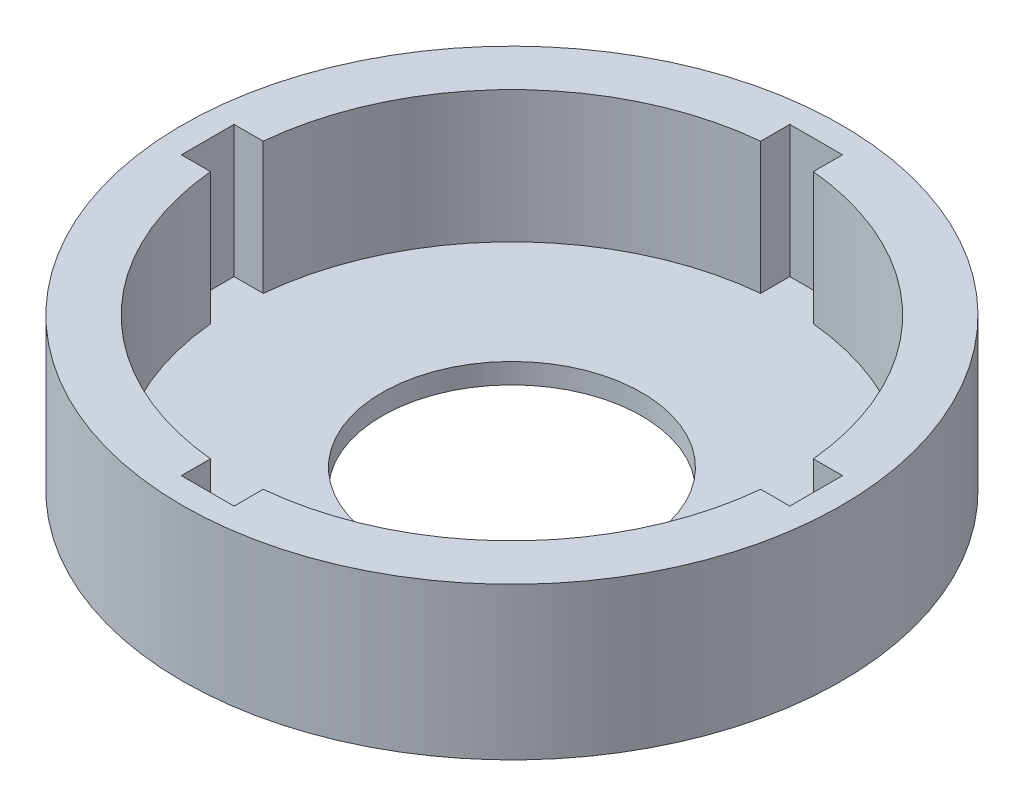
ISO-10303-21;
HEADER;
FILE_DESCRIPTION(('STEP AP214'),'2;1');
FILE_NAME('part.step','',(''),(''),'','','');
FILE_SCHEMA(('AUTOMOTIVE_DESIGN { 1 0 10303 214 1 1 1 1 }'));
ENDSEC;
DATA;
#1=APPLICATION_CONTEXT('core data for automotive mechanical design processes');
#2=APPLICATION_PROTOCOL_DEFINITION('international standard','automotive_design',2000,#1);
#3=PRODUCT_CONTEXT('',#1,'mechanical');
#4=PRODUCT('Part','Part','',(#3));
#5=PRODUCT_RELATED_PRODUCT_CATEGORY('part','',(#4));
#6=PRODUCT_DEFINITION_FORMATION('','',#4);
#7=PRODUCT_DEFINITION_CONTEXT('part definition',#1,'design');
#8=PRODUCT_DEFINITION('design','',#6,#7);
#9=PRODUCT_DEFINITION_SHAPE('','',#8);
#10=(LENGTH_UNIT() NAMED_UNIT(*) SI_UNIT(.MILLI.,.METRE.));
#11=(NAMED_UNIT(*) PLANE_ANGLE_UNIT() SI_UNIT($,.RADIAN.));
#12=(NAMED_UNIT(*) SI_UNIT($,.STERADIAN.) SOLID_ANGLE_UNIT());
#13=UNCERTAINTY_MEASURE_WITH_UNIT(LENGTH_MEASURE(1.E-05),#10,'distance_accuracy_value','');
#14=(GEOMETRIC_REPRESENTATION_CONTEXT(3) GLOBAL_UNCERTAINTY_ASSIGNED_CONTEXT((#13)) GLOBAL_UNIT_ASSIGNED_CONTEXT((#10,
#11,#12)) REPRESENTATION_CONTEXT('',''));
#15=CARTESIAN_POINT('',(0.,0.,0.));
#16=DIRECTION('',(0.,0.,1.));
#17=DIRECTION('',(1.,0.,0.));
#18=AXIS2_PLACEMENT_3D('',#15,#16,#17);
#19=CARTESIAN_POINT('',(0.,2.,0.));
#20=DIRECTION('',(0.,1.,0.));
#21=DIRECTION('',(0.,0.,1.));
#22=AXIS2_PLACEMENT_3D('',#19,#20,#21);
#23=PLANE('',#22);
#24=CARTESIAN_POINT('',(0.,2.,0.));
#25=DIRECTION('',(0.,1.,0.));
#26=DIRECTION('',(0.,0.,1.));
#27=AXIS2_PLACEMENT_3D('',#24,#25,#26);
#28=CIRCLE('',#27,27.25);
#29=CARTESIAN_POINT('',(2.6,2.,27.1256797149859));
#30=VERTEX_POINT('',#29);
#31=CARTESIAN_POINT('',(27.1256797149859,2.,2.59999999999999));
#32=VERTEX_POINT('',#31);
#33=EDGE_CURVE('E199',#30,#32,#28,.T.);
#34=ORIENTED_EDGE('',*,*,#33,.T.);
#35=DIRECTION('',(-1.,0.,0.));
#36=VECTOR('',#35,1.);
#37=CARTESIAN_POINT('',(0.,2.,2.6));
#38=LINE('',#37,#36);
#39=CARTESIAN_POINT('',(30.,2.,2.59999999999999));
#40=VERTEX_POINT('',#39);
#41=EDGE_CURVE('E244',#40,#32,#38,.T.);
#42=ORIENTED_EDGE('',*,*,#41,.F.);
#43=DIRECTION('',(0.,0.,1.));
#44=VECTOR('',#43,1.);
#45=CARTESIAN_POINT('',(30.,2.,0.));
#46=LINE('',#45,#44);
#47=CARTESIAN_POINT('',(30.,2.,-2.60000000000001));
#48=VERTEX_POINT('',#47);
#49=EDGE_CURVE('E241',#48,#40,#46,.T.);
#50=ORIENTED_EDGE('',*,*,#49,.F.);
#51=DIRECTION('',(-1.,0.,0.));
#52=VECTOR('',#51,1.);
#53=CARTESIAN_POINT('',(0.,2.,-2.6));
#54=LINE('',#53,#52);
#55=CARTESIAN_POINT('',(27.1256797149859,2.,-2.60000000000001));
#56=VERTEX_POINT('',#55);
#57=EDGE_CURVE('E168',#48,#56,#54,.T.);
#58=ORIENTED_EDGE('',*,*,#57,.T.);
#59=CARTESIAN_POINT('',(2.60000000000001,2.,-27.1256797149859));
#60=VERTEX_POINT('',#59);
#61=EDGE_CURVE('E204',#56,#60,#28,.T.);
#62=ORIENTED_EDGE('',*,*,#61,.T.);
#63=DIRECTION('',(0.,0.,1.));
#64=VECTOR('',#63,1.);
#65=CARTESIAN_POINT('',(2.60000000000001,2.,0.));
#66=LINE('',#65,#64);
#67=CARTESIAN_POINT('',(2.60000000000001,2.,-30.));
#68=VERTEX_POINT('',#67);
#69=EDGE_CURVE('E235',#68,#60,#66,.T.);
#70=ORIENTED_EDGE('',*,*,#69,.F.);
#71=DIRECTION('',(1.,0.,0.));
#72=VECTOR('',#71,1.);
#73=CARTESIAN_POINT('',(0.,2.,-30.));
#74=LINE('',#73,#72);
#75=CARTESIAN_POINT('',(-2.59999999999999,2.,-30.));
#76=VERTEX_POINT('',#75);
#77=EDGE_CURVE('E232',#76,#68,#74,.T.);
#78=ORIENTED_EDGE('',*,*,#77,.F.);
#79=DIRECTION('',(0.,0.,1.));
#80=VECTOR('',#79,1.);
#81=CARTESIAN_POINT('',(-2.59999999999999,2.,0.));
#82=LINE('',#81,#80);
#83=CARTESIAN_POINT('',(-2.59999999999999,2.,-27.1256797149859));
#84=VERTEX_POINT('',#83);
#85=EDGE_CURVE('E228',#76,#84,#82,.T.);
#86=ORIENTED_EDGE('',*,*,#85,.T.);
#87=CARTESIAN_POINT('',(-27.1256797149859,2.,-2.60000000000002));
#88=VERTEX_POINT('',#87);
#89=EDGE_CURVE('E227',#84,#88,#28,.T.);
#90=ORIENTED_EDGE('',*,*,#89,.T.);
#91=DIRECTION('',(1.,0.,0.));
#92=VECTOR('',#91,1.);
#93=CARTESIAN_POINT('',(0.,2.,-2.60000000000002));
#94=LINE('',#93,#92);
#95=CARTESIAN_POINT('',(-30.,2.,-2.60000000000002));
#96=VERTEX_POINT('',#95);
#97=EDGE_CURVE('E223',#96,#88,#94,.T.);
#98=ORIENTED_EDGE('',*,*,#97,.F.);
#99=DIRECTION('',(0.,0.,-1.));
#100=VECTOR('',#99,1.);
#101=CARTESIAN_POINT('',(-30.,2.,0.));
#102=LINE('',#101,#100);
#103=CARTESIAN_POINT('',(-30.,2.,2.59999999999998));
#104=VERTEX_POINT('',#103);
#105=EDGE_CURVE('E220',#104,#96,#102,.T.);
#106=ORIENTED_EDGE('',*,*,#105,.F.);
#107=DIRECTION('',(1.,0.,0.));
#108=VECTOR('',#107,1.);
#109=CARTESIAN_POINT('',(0.,2.,2.59999999999998));
#110=LINE('',#109,#108);
#111=CARTESIAN_POINT('',(-27.1256797149859,2.,2.59999999999998));
#112=VERTEX_POINT('',#111);
#113=EDGE_CURVE('E216',#104,#112,#110,.T.);
#114=ORIENTED_EDGE('',*,*,#113,.T.);
#115=CARTESIAN_POINT('',(-2.6,2.,27.1256797149859));
#116=VERTEX_POINT('',#115);
#117=EDGE_CURVE('E205',#112,#116,#28,.T.);
#118=ORIENTED_EDGE('',*,*,#117,.T.);
#119=DIRECTION('',(0.,0.,-1.));
#120=VECTOR('',#119,1.);
#121=CARTESIAN_POINT('',(-2.6,2.,0.));
#122=LINE('',#121,#120);
#123=CARTESIAN_POINT('',(-2.6,2.,30.));
#124=VERTEX_POINT('',#123);
#125=EDGE_CURVE('E212',#124,#116,#122,.T.);
#126=ORIENTED_EDGE('',*,*,#125,.F.);
#127=DIRECTION('',(-1.,0.,0.));
#128=VECTOR('',#127,1.);
#129=CARTESIAN_POINT('',(0.,2.,30.));
#130=LINE('',#129,#128);
#131=CARTESIAN_POINT('',(2.6,2.,30.));
#132=VERTEX_POINT('',#131);
#133=EDGE_CURVE('E209',#132,#124,#130,.T.);
#134=ORIENTED_EDGE('',*,*,#133,.F.);
#135=DIRECTION('',(0.,0.,-1.));
#136=VECTOR('',#135,1.);
#137=CARTESIAN_POINT('',(2.6,2.,0.));
#138=LINE('',#137,#136);
#139=EDGE_CURVE('E203',#132,#30,#138,.T.);
#140=ORIENTED_EDGE('',*,*,#139,.T.);
#141=EDGE_LOOP('',(#34,#42,#50,#58,#62,#70,#78,#86,#90,#98,#106,#114,#118,#126,#134,#140));
#142=FACE_BOUND('',#141,.T.);
#143=CARTESIAN_POINT('',(0.,2.,0.));
#144=DIRECTION('',(0.,1.,0.));
#145=DIRECTION('',(0.,0.,1.));
#146=AXIS2_PLACEMENT_3D('',#143,#144,#145);
#147=CIRCLE('',#146,12.8);
#148=CARTESIAN_POINT('',(0.,2.,12.8));
#149=VERTEX_POINT('',#148);
#150=EDGE_CURVE('E50',#149,#149,#147,.T.);
#151=ORIENTED_EDGE('',*,*,#150,.F.);
#152=EDGE_LOOP('',(#151));
#153=FACE_BOUND('',#152,.T.);
#154=ADVANCED_FACE('F41',(#142,#153),#23,.T.);
#155=CARTESIAN_POINT('',(0.,0.,0.));
#156=DIRECTION('',(0.,1.,0.));
#157=DIRECTION('',(0.,0.,1.));
#158=AXIS2_PLACEMENT_3D('',#155,#156,#157);
#159=PLANE('',#158);
#160=CARTESIAN_POINT('',(0.,0.,0.));
#161=DIRECTION('',(0.,1.,0.));
#162=DIRECTION('',(0.,0.,1.));
#163=AXIS2_PLACEMENT_3D('',#160,#161,#162);
#164=CIRCLE('',#163,32.5);
#165=CARTESIAN_POINT('',(0.,0.,32.5));
#166=VERTEX_POINT('',#165);
#167=EDGE_CURVE('E11',#166,#166,#164,.T.);
#168=ORIENTED_EDGE('',*,*,#167,.F.);
#169=EDGE_LOOP('',(#168));
#170=FACE_BOUND('',#169,.T.);
#171=CARTESIAN_POINT('',(0.,0.,0.));
#172=DIRECTION('',(0.,1.,0.));
#173=DIRECTION('',(0.,0.,1.));
#174=AXIS2_PLACEMENT_3D('',#171,#172,#173);
#175=CIRCLE('',#174,12.8);
#176=CARTESIAN_POINT('',(0.,0.,12.8));
#177=VERTEX_POINT('',#176);
#178=EDGE_CURVE('E291',#177,#177,#175,.T.);
#179=ORIENTED_EDGE('',*,*,#178,.T.);
#180=EDGE_LOOP('',(#179));
#181=FACE_BOUND('',#180,.T.);
#182=ADVANCED_FACE('F298',(#170,#181),#159,.F.);
#183=CARTESIAN_POINT('',(0.,2.,0.));
#184=DIRECTION('',(0.,-1.,0.));
#185=DIRECTION('',(0.,0.,-1.));
#186=AXIS2_PLACEMENT_3D('',#183,#184,#185);
#187=CYLINDRICAL_SURFACE('',#186,32.5);
#188=ORIENTED_EDGE('',*,*,#167,.T.);
#189=EDGE_LOOP('',(#188));
#190=FACE_BOUND('',#189,.T.);
#191=CARTESIAN_POINT('',(0.,15.,0.));
#192=DIRECTION('',(0.,1.,0.));
#193=DIRECTION('',(0.,0.,1.));
#194=AXIS2_PLACEMENT_3D('',#191,#192,#193);
#195=CIRCLE('',#194,32.5);
#196=CARTESIAN_POINT('',(0.,15.,32.5));
#197=VERTEX_POINT('',#196);
#198=EDGE_CURVE('E195',#197,#197,#195,.T.);
#199=ORIENTED_EDGE('',*,*,#198,.F.);
#200=EDGE_LOOP('',(#199));
#201=FACE_BOUND('',#200,.T.);
#202=ADVANCED_FACE('F43',(#190,#201),#187,.T.);
#203=CARTESIAN_POINT('',(0.,2.,0.));
#204=DIRECTION('',(0.,-1.,0.));
#205=DIRECTION('',(0.,0.,-1.));
#206=AXIS2_PLACEMENT_3D('',#203,#204,#205);
#207=CYLINDRICAL_SURFACE('',#206,12.8);
#208=ORIENTED_EDGE('',*,*,#150,.T.);
#209=EDGE_LOOP('',(#208));
#210=FACE_BOUND('',#209,.T.);
#211=ORIENTED_EDGE('',*,*,#178,.F.);
#212=EDGE_LOOP('',(#211));
#213=FACE_BOUND('',#212,.T.);
#214=ADVANCED_FACE('F300',(#210,#213),#207,.F.);
#215=CARTESIAN_POINT('',(0.,15.,0.));
#216=DIRECTION('',(0.,-1.,0.));
#217=DIRECTION('',(0.,0.,-1.));
#218=AXIS2_PLACEMENT_3D('',#215,#216,#217);
#219=CYLINDRICAL_SURFACE('',#218,27.25);
#220=ORIENTED_EDGE('',*,*,#33,.F.);
#221=DIRECTION('',(0.,-1.,0.));
#222=VECTOR('',#221,1.);
#223=CARTESIAN_POINT('',(2.6,15.,27.1256797149859));
#224=LINE('',#223,#222);
#225=CARTESIAN_POINT('',(2.6,15.,27.1256797149859));
#226=VERTEX_POINT('',#225);
#227=EDGE_CURVE('E122',#226,#30,#224,.T.);
#228=ORIENTED_EDGE('',*,*,#227,.F.);
#229=CARTESIAN_POINT('',(0.,15.,0.));
#230=DIRECTION('',(0.,1.,0.));
#231=DIRECTION('',(0.,0.,1.));
#232=AXIS2_PLACEMENT_3D('',#229,#230,#231);
#233=CIRCLE('',#232,27.25);
#234=CARTESIAN_POINT('',(27.1256797149859,15.,2.59999999999999));
#235=VERTEX_POINT('',#234);
#236=EDGE_CURVE('E189',#226,#235,#233,.T.);
#237=ORIENTED_EDGE('',*,*,#236,.T.);
#238=DIRECTION('',(0.,-1.,0.));
#239=VECTOR('',#238,1.);
#240=CARTESIAN_POINT('',(27.1256797149859,15.,2.59999999999999));
#241=LINE('',#240,#239);
#242=EDGE_CURVE('E118',#235,#32,#241,.T.);
#243=ORIENTED_EDGE('',*,*,#242,.T.);
#244=EDGE_LOOP('',(#220,#228,#237,#243));
#245=FACE_BOUND('',#244,.T.);
#246=ADVANCED_FACE('F302',(#245),#219,.F.);
#247=CARTESIAN_POINT('',(2.6,15.,0.));
#248=DIRECTION('',(-1.,0.,0.));
#249=DIRECTION('',(0.,0.,1.));
#250=AXIS2_PLACEMENT_3D('',#247,#248,#249);
#251=PLANE('',#250);
#252=ORIENTED_EDGE('',*,*,#139,.F.);
#253=DIRECTION('',(0.,-1.,0.));
#254=VECTOR('',#253,1.);
#255=CARTESIAN_POINT('',(2.6,15.,30.));
#256=LINE('',#255,#254);
#257=CARTESIAN_POINT('',(2.6,15.,30.));
#258=VERTEX_POINT('',#257);
#259=EDGE_CURVE('E286',#258,#132,#256,.T.);
#260=ORIENTED_EDGE('',*,*,#259,.F.);
#261=DIRECTION('',(0.,0.,-1.));
#262=VECTOR('',#261,1.);
#263=CARTESIAN_POINT('',(2.6,15.,0.));
#264=LINE('',#263,#262);
#265=EDGE_CURVE('E332',#258,#226,#264,.T.);
#266=ORIENTED_EDGE('',*,*,#265,.T.);
#267=ORIENTED_EDGE('',*,*,#227,.T.);
#268=EDGE_LOOP('',(#252,#260,#266,#267));
#269=FACE_BOUND('',#268,.T.);
#270=ADVANCED_FACE('F309',(#269),#251,.T.);
#271=CARTESIAN_POINT('',(0.,15.,30.));
#272=DIRECTION('',(0.,0.,1.));
#273=DIRECTION('',(1.,0.,0.));
#274=AXIS2_PLACEMENT_3D('',#271,#272,#273);
#275=PLANE('',#274);
#276=ORIENTED_EDGE('',*,*,#133,.T.);
#277=DIRECTION('',(0.,-1.,0.));
#278=VECTOR('',#277,1.);
#279=CARTESIAN_POINT('',(-2.6,15.,30.));
#280=LINE('',#279,#278);
#281=CARTESIAN_POINT('',(-2.6,15.,30.));
#282=VERTEX_POINT('',#281);
#283=EDGE_CURVE('E282',#282,#124,#280,.T.);
#284=ORIENTED_EDGE('',*,*,#283,.F.);
#285=DIRECTION('',(-1.,0.,0.));
#286=VECTOR('',#285,1.);
#287=CARTESIAN_POINT('',(0.,15.,30.));
#288=LINE('',#287,#286);
#289=EDGE_CURVE('E334',#258,#282,#288,.T.);
#290=ORIENTED_EDGE('',*,*,#289,.F.);
#291=ORIENTED_EDGE('',*,*,#259,.T.);
#292=EDGE_LOOP('',(#276,#284,#290,#291));
#293=FACE_BOUND('',#292,.T.);
#294=ADVANCED_FACE('F390',(#293),#275,.F.);
#295=CARTESIAN_POINT('',(-2.6,15.,0.));
#296=DIRECTION('',(-1.,0.,0.));
#297=DIRECTION('',(0.,0.,1.));
#298=AXIS2_PLACEMENT_3D('',#295,#296,#297);
#299=PLANE('',#298);
#300=ORIENTED_EDGE('',*,*,#125,.T.);
#301=DIRECTION('',(0.,-1.,0.));
#302=VECTOR('',#301,1.);
#303=CARTESIAN_POINT('',(-2.6,15.,27.1256797149859));
#304=LINE('',#303,#302);
#305=CARTESIAN_POINT('',(-2.6,15.,27.1256797149859));
#306=VERTEX_POINT('',#305);
#307=EDGE_CURVE('E279',#306,#116,#304,.T.);
#308=ORIENTED_EDGE('',*,*,#307,.F.);
#309=DIRECTION('',(0.,0.,-1.));
#310=VECTOR('',#309,1.);
#311=CARTESIAN_POINT('',(-2.6,15.,0.));
#312=LINE('',#311,#310);
#313=EDGE_CURVE('E338',#282,#306,#312,.T.);
#314=ORIENTED_EDGE('',*,*,#313,.F.);
#315=ORIENTED_EDGE('',*,*,#283,.T.);
#316=EDGE_LOOP('',(#300,#308,#314,#315));
#317=FACE_BOUND('',#316,.T.);
#318=ADVANCED_FACE('F387',(#317),#299,.F.);
#319=ORIENTED_EDGE('',*,*,#117,.F.);
#320=DIRECTION('',(0.,-1.,0.));
#321=VECTOR('',#320,1.);
#322=CARTESIAN_POINT('',(-27.1256797149859,15.,2.59999999999998));
#323=LINE('',#322,#321);
#324=CARTESIAN_POINT('',(-27.1256797149859,15.,2.59999999999998));
#325=VERTEX_POINT('',#324);
#326=EDGE_CURVE('E276',#325,#112,#323,.T.);
#327=ORIENTED_EDGE('',*,*,#326,.F.);
#328=EDGE_CURVE('E340',#325,#306,#233,.T.);
#329=ORIENTED_EDGE('',*,*,#328,.T.);
#330=ORIENTED_EDGE('',*,*,#307,.T.);
#331=EDGE_LOOP('',(#319,#327,#329,#330));
#332=FACE_BOUND('',#331,.T.);
#333=ADVANCED_FACE('F311',(#332),#219,.F.);
#334=CARTESIAN_POINT('',(0.,15.,2.59999999999998));
#335=DIRECTION('',(0.,0.,-1.));
#336=DIRECTION('',(-1.,0.,0.));
#337=AXIS2_PLACEMENT_3D('',#334,#335,#336);
#338=PLANE('',#337);
#339=ORIENTED_EDGE('',*,*,#113,.F.);
#340=DIRECTION('',(0.,-1.,0.));
#341=VECTOR('',#340,1.);
#342=CARTESIAN_POINT('',(-30.,15.,2.59999999999998));
#343=LINE('',#342,#341);
#344=CARTESIAN_POINT('',(-30.,15.,2.59999999999998));
#345=VERTEX_POINT('',#344);
#346=EDGE_CURVE('E273',#345,#104,#343,.T.);
#347=ORIENTED_EDGE('',*,*,#346,.F.);
#348=DIRECTION('',(1.,0.,0.));
#349=VECTOR('',#348,1.);
#350=CARTESIAN_POINT('',(0.,15.,2.59999999999998));
#351=LINE('',#350,#349);
#352=EDGE_CURVE('E344',#345,#325,#351,.T.);
#353=ORIENTED_EDGE('',*,*,#352,.T.);
#354=ORIENTED_EDGE('',*,*,#326,.T.);
#355=EDGE_LOOP('',(#339,#347,#353,#354));
#356=FACE_BOUND('',#355,.T.);
#357=ADVANCED_FACE('F394',(#356),#338,.T.);
#358=CARTESIAN_POINT('',(-30.,15.,0.));
#359=DIRECTION('',(-1.,0.,0.));
#360=DIRECTION('',(0.,0.,1.));
#361=AXIS2_PLACEMENT_3D('',#358,#359,#360);
#362=PLANE('',#361);
#363=ORIENTED_EDGE('',*,*,#105,.T.);
#364=DIRECTION('',(0.,-1.,0.));
#365=VECTOR('',#364,1.);
#366=CARTESIAN_POINT('',(-30.,15.,-2.60000000000002));
#367=LINE('',#366,#365);
#368=CARTESIAN_POINT('',(-30.,15.,-2.60000000000002));
#369=VERTEX_POINT('',#368);
#370=EDGE_CURVE('E269',#369,#96,#367,.T.);
#371=ORIENTED_EDGE('',*,*,#370,.F.);
#372=DIRECTION('',(0.,0.,-1.));
#373=VECTOR('',#372,1.);
#374=CARTESIAN_POINT('',(-30.,15.,0.));
#375=LINE('',#374,#373);
#376=EDGE_CURVE('E348',#345,#369,#375,.T.);
#377=ORIENTED_EDGE('',*,*,#376,.F.);
#378=ORIENTED_EDGE('',*,*,#346,.T.);
#379=EDGE_LOOP('',(#363,#371,#377,#378));
#380=FACE_BOUND('',#379,.T.);
#381=ADVANCED_FACE('F398',(#380),#362,.F.);
#382=CARTESIAN_POINT('',(0.,15.,-2.60000000000002));
#383=DIRECTION('',(0.,0.,-1.));
#384=DIRECTION('',(-1.,0.,0.));
#385=AXIS2_PLACEMENT_3D('',#382,#383,#384);
#386=PLANE('',#385);
#387=ORIENTED_EDGE('',*,*,#97,.T.);
#388=DIRECTION('',(0.,-1.,0.));
#389=VECTOR('',#388,1.);
#390=CARTESIAN_POINT('',(-27.1256797149859,15.,-2.60000000000002));
#391=LINE('',#390,#389);
#392=CARTESIAN_POINT('',(-27.1256797149859,15.,-2.60000000000002));
#393=VERTEX_POINT('',#392);
#394=EDGE_CURVE('E266',#393,#88,#391,.T.);
#395=ORIENTED_EDGE('',*,*,#394,.F.);
#396=DIRECTION('',(1.,0.,0.));
#397=VECTOR('',#396,1.);
#398=CARTESIAN_POINT('',(0.,15.,-2.60000000000002));
#399=LINE('',#398,#397);
#400=EDGE_CURVE('E351',#369,#393,#399,.T.);
#401=ORIENTED_EDGE('',*,*,#400,.F.);
#402=ORIENTED_EDGE('',*,*,#370,.T.);
#403=EDGE_LOOP('',(#387,#395,#401,#402));
#404=FACE_BOUND('',#403,.T.);
#405=ADVANCED_FACE('F404',(#404),#386,.F.);
#406=ORIENTED_EDGE('',*,*,#89,.F.);
#407=DIRECTION('',(0.,-1.,0.));
#408=VECTOR('',#407,1.);
#409=CARTESIAN_POINT('',(-2.59999999999999,15.,-27.1256797149859));
#410=LINE('',#409,#408);
#411=CARTESIAN_POINT('',(-2.59999999999999,15.,-27.1256797149859));
#412=VERTEX_POINT('',#411);
#413=EDGE_CURVE('E263',#412,#84,#410,.T.);
#414=ORIENTED_EDGE('',*,*,#413,.F.);
#415=EDGE_CURVE('E188',#412,#393,#233,.T.);
#416=ORIENTED_EDGE('',*,*,#415,.T.);
#417=ORIENTED_EDGE('',*,*,#394,.T.);
#418=EDGE_LOOP('',(#406,#414,#416,#417));
#419=FACE_BOUND('',#418,.T.);
#420=ADVANCED_FACE('F406',(#419),#219,.F.);
#421=CARTESIAN_POINT('',(-2.59999999999999,15.,0.));
#422=DIRECTION('',(1.,0.,0.));
#423=DIRECTION('',(0.,0.,-1.));
#424=AXIS2_PLACEMENT_3D('',#421,#422,#423);
#425=PLANE('',#424);
#426=ORIENTED_EDGE('',*,*,#85,.F.);
#427=DIRECTION('',(0.,-1.,0.));
#428=VECTOR('',#427,1.);
#429=CARTESIAN_POINT('',(-2.59999999999999,15.,-30.));
#430=LINE('',#429,#428);
#431=CARTESIAN_POINT('',(-2.59999999999999,15.,-30.));
#432=VERTEX_POINT('',#431);
#433=EDGE_CURVE('E260',#432,#76,#430,.T.);
#434=ORIENTED_EDGE('',*,*,#433,.F.);
#435=DIRECTION('',(0.,0.,1.));
#436=VECTOR('',#435,1.);
#437=CARTESIAN_POINT('',(-2.59999999999999,15.,0.));
#438=LINE('',#437,#436);
#439=EDGE_CURVE('E354',#432,#412,#438,.T.);
#440=ORIENTED_EDGE('',*,*,#439,.T.);
#441=ORIENTED_EDGE('',*,*,#413,.T.);
#442=EDGE_LOOP('',(#426,#434,#440,#441));
#443=FACE_BOUND('',#442,.T.);
#444=ADVANCED_FACE('F410',(#443),#425,.T.);
#445=CARTESIAN_POINT('',(0.,15.,-30.));
#446=DIRECTION('',(0.,0.,-1.));
#447=DIRECTION('',(-1.,0.,0.));
#448=AXIS2_PLACEMENT_3D('',#445,#446,#447);
#449=PLANE('',#448);
#450=ORIENTED_EDGE('',*,*,#77,.T.);
#451=DIRECTION('',(0.,-1.,0.));
#452=VECTOR('',#451,1.);
#453=CARTESIAN_POINT('',(2.60000000000001,15.,-30.));
#454=LINE('',#453,#452);
#455=CARTESIAN_POINT('',(2.60000000000001,15.,-30.));
#456=VERTEX_POINT('',#455);
#457=EDGE_CURVE('E256',#456,#68,#454,.T.);
#458=ORIENTED_EDGE('',*,*,#457,.F.);
#459=DIRECTION('',(1.,0.,0.));
#460=VECTOR('',#459,1.);
#461=CARTESIAN_POINT('',(0.,15.,-30.));
#462=LINE('',#461,#460);
#463=EDGE_CURVE('E357',#432,#456,#462,.T.);
#464=ORIENTED_EDGE('',*,*,#463,.F.);
#465=ORIENTED_EDGE('',*,*,#433,.T.);
#466=EDGE_LOOP('',(#450,#458,#464,#465));
#467=FACE_BOUND('',#466,.T.);
#468=ADVANCED_FACE('F413',(#467),#449,.F.);
#469=CARTESIAN_POINT('',(2.60000000000001,15.,0.));
#470=DIRECTION('',(1.,0.,0.));
#471=DIRECTION('',(0.,0.,-1.));
#472=AXIS2_PLACEMENT_3D('',#469,#470,#471);
#473=PLANE('',#472);
#474=ORIENTED_EDGE('',*,*,#69,.T.);
#475=DIRECTION('',(0.,-1.,0.));
#476=VECTOR('',#475,1.);
#477=CARTESIAN_POINT('',(2.60000000000001,15.,-27.1256797149859));
#478=LINE('',#477,#476);
#479=CARTESIAN_POINT('',(2.60000000000001,15.,-27.1256797149859));
#480=VERTEX_POINT('',#479);
#481=EDGE_CURVE('E253',#480,#60,#478,.T.);
#482=ORIENTED_EDGE('',*,*,#481,.F.);
#483=DIRECTION('',(0.,0.,1.));
#484=VECTOR('',#483,1.);
#485=CARTESIAN_POINT('',(2.60000000000001,15.,0.));
#486=LINE('',#485,#484);
#487=EDGE_CURVE('E186',#456,#480,#486,.T.);
#488=ORIENTED_EDGE('',*,*,#487,.F.);
#489=ORIENTED_EDGE('',*,*,#457,.T.);
#490=EDGE_LOOP('',(#474,#482,#488,#489));
#491=FACE_BOUND('',#490,.T.);
#492=ADVANCED_FACE('F366',(#491),#473,.F.);
#493=ORIENTED_EDGE('',*,*,#61,.F.);
#494=DIRECTION('',(0.,-1.,0.));
#495=VECTOR('',#494,1.);
#496=CARTESIAN_POINT('',(27.1256797149859,15.,-2.60000000000001));
#497=LINE('',#496,#495);
#498=CARTESIAN_POINT('',(27.1256797149859,15.,-2.60000000000001));
#499=VERTEX_POINT('',#498);
#500=EDGE_CURVE('E172',#499,#56,#497,.T.);
#501=ORIENTED_EDGE('',*,*,#500,.F.);
#502=EDGE_CURVE('E182',#499,#480,#233,.T.);
#503=ORIENTED_EDGE('',*,*,#502,.T.);
#504=ORIENTED_EDGE('',*,*,#481,.T.);
#505=EDGE_LOOP('',(#493,#501,#503,#504));
#506=FACE_BOUND('',#505,.T.);
#507=ADVANCED_FACE('F312',(#506),#219,.F.);
#508=CARTESIAN_POINT('',(0.,15.,-2.6));
#509=DIRECTION('',(0.,0.,1.));
#510=DIRECTION('',(1.,0.,0.));
#511=AXIS2_PLACEMENT_3D('',#508,#509,#510);
#512=PLANE('',#511);
#513=ORIENTED_EDGE('',*,*,#57,.F.);
#514=DIRECTION('',(0.,-1.,0.));
#515=VECTOR('',#514,1.);
#516=CARTESIAN_POINT('',(30.,15.,-2.60000000000001));
#517=LINE('',#516,#515);
#518=CARTESIAN_POINT('',(30.,15.,-2.60000000000001));
#519=VERTEX_POINT('',#518);
#520=EDGE_CURVE('E162',#519,#48,#517,.T.);
#521=ORIENTED_EDGE('',*,*,#520,.F.);
#522=DIRECTION('',(-1.,0.,0.));
#523=VECTOR('',#522,1.);
#524=CARTESIAN_POINT('',(0.,15.,-2.6));
#525=LINE('',#524,#523);
#526=EDGE_CURVE('E166',#519,#499,#525,.T.);
#527=ORIENTED_EDGE('',*,*,#526,.T.);
#528=ORIENTED_EDGE('',*,*,#500,.T.);
#529=EDGE_LOOP('',(#513,#521,#527,#528));
#530=FACE_BOUND('',#529,.T.);
#531=ADVANCED_FACE('F164',(#530),#512,.T.);
#532=CARTESIAN_POINT('',(30.,15.,0.));
#533=DIRECTION('',(1.,0.,0.));
#534=DIRECTION('',(0.,0.,-1.));
#535=AXIS2_PLACEMENT_3D('',#532,#533,#534);
#536=PLANE('',#535);
#537=ORIENTED_EDGE('',*,*,#49,.T.);
#538=DIRECTION('',(0.,-1.,0.));
#539=VECTOR('',#538,1.);
#540=CARTESIAN_POINT('',(30.,15.,2.59999999999999));
#541=LINE('',#540,#539);
#542=CARTESIAN_POINT('',(30.,15.,2.59999999999999));
#543=VERTEX_POINT('',#542);
#544=EDGE_CURVE('E57',#543,#40,#541,.T.);
#545=ORIENTED_EDGE('',*,*,#544,.F.);
#546=DIRECTION('',(0.,0.,1.));
#547=VECTOR('',#546,1.);
#548=CARTESIAN_POINT('',(30.,15.,0.));
#549=LINE('',#548,#547);
#550=EDGE_CURVE('E174',#519,#543,#549,.T.);
#551=ORIENTED_EDGE('',*,*,#550,.F.);
#552=ORIENTED_EDGE('',*,*,#520,.T.);
#553=EDGE_LOOP('',(#537,#545,#551,#552));
#554=FACE_BOUND('',#553,.T.);
#555=ADVANCED_FACE('F175',(#554),#536,.F.);
#556=CARTESIAN_POINT('',(0.,15.,2.6));
#557=DIRECTION('',(0.,0.,1.));
#558=DIRECTION('',(1.,0.,0.));
#559=AXIS2_PLACEMENT_3D('',#556,#557,#558);
#560=PLANE('',#559);
#561=ORIENTED_EDGE('',*,*,#41,.T.);
#562=ORIENTED_EDGE('',*,*,#242,.F.);
#563=DIRECTION('',(-1.,0.,0.));
#564=VECTOR('',#563,1.);
#565=CARTESIAN_POINT('',(0.,15.,2.6));
#566=LINE('',#565,#564);
#567=EDGE_CURVE('E65',#543,#235,#566,.T.);
#568=ORIENTED_EDGE('',*,*,#567,.F.);
#569=ORIENTED_EDGE('',*,*,#544,.T.);
#570=EDGE_LOOP('',(#561,#562,#568,#569));
#571=FACE_BOUND('',#570,.T.);
#572=ADVANCED_FACE('F505',(#571),#560,.F.);
#573=CARTESIAN_POINT('',(0.,15.,0.));
#574=DIRECTION('',(0.,1.,0.));
#575=DIRECTION('',(0.,0.,1.));
#576=AXIS2_PLACEMENT_3D('',#573,#574,#575);
#577=PLANE('',#576);
#578=ORIENTED_EDGE('',*,*,#236,.F.);
#579=ORIENTED_EDGE('',*,*,#265,.F.);
#580=ORIENTED_EDGE('',*,*,#289,.T.);
#581=ORIENTED_EDGE('',*,*,#313,.T.);
#582=ORIENTED_EDGE('',*,*,#328,.F.);
#583=ORIENTED_EDGE('',*,*,#352,.F.);
#584=ORIENTED_EDGE('',*,*,#376,.T.);
#585=ORIENTED_EDGE('',*,*,#400,.T.);
#586=ORIENTED_EDGE('',*,*,#415,.F.);
#587=ORIENTED_EDGE('',*,*,#439,.F.);
#588=ORIENTED_EDGE('',*,*,#463,.T.);
#589=ORIENTED_EDGE('',*,*,#487,.T.);
#590=ORIENTED_EDGE('',*,*,#502,.F.);
#591=ORIENTED_EDGE('',*,*,#526,.F.);
#592=ORIENTED_EDGE('',*,*,#550,.T.);
#593=ORIENTED_EDGE('',*,*,#567,.T.);
#594=EDGE_LOOP('',(#578,#579,#580,#581,#582,#583,#584,#585,#586,#587,#588,#589,#590,#591,#592,#593));
#595=FACE_BOUND('',#594,.T.);
#596=ORIENTED_EDGE('',*,*,#198,.T.);
#597=EDGE_LOOP('',(#596));
#598=FACE_BOUND('',#597,.T.);
#599=ADVANCED_FACE('F179',(#595,#598),#577,.T.);
#600=CLOSED_SHELL('',(#154,#182,#202,#214,#246,#270,#294,#318,#333,#357,#381,#405,#420,#444,
#468,#492,#507,#531,#555,#572,#599));
#601=MANIFOLD_SOLID_BREP('B2',#600);
#602=ADVANCED_BREP_SHAPE_REPRESENTATION('',(#18,#601),#14);
#603=SHAPE_DEFINITION_REPRESENTATION(#9,#602);
ENDSEC;
END-ISO-10303-21;
